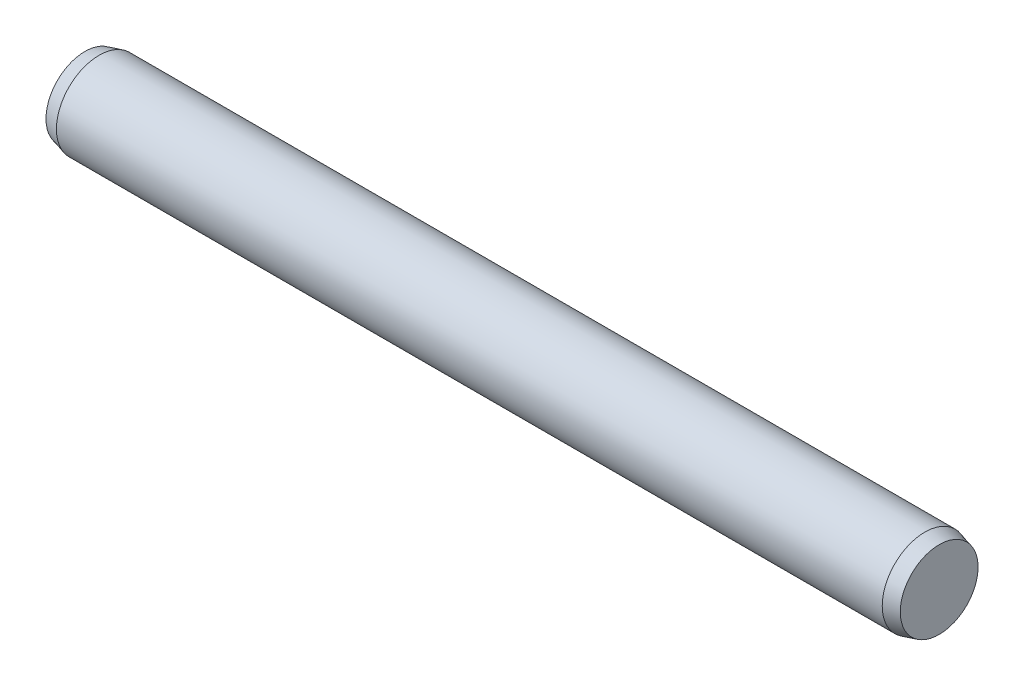
ISO-10303-21;
HEADER;
FILE_DESCRIPTION(('STEP AP214'),'2;1');
FILE_NAME('part.step','',(''),(''),'','','');
FILE_SCHEMA(('AUTOMOTIVE_DESIGN { 1 0 10303 214 1 1 1 1 }'));
ENDSEC;
DATA;
#1=APPLICATION_CONTEXT('core data for automotive mechanical design processes');
#2=APPLICATION_PROTOCOL_DEFINITION('international standard','automotive_design',2000,#1);
#3=PRODUCT_CONTEXT('',#1,'mechanical');
#4=PRODUCT('Part','Part','',(#3));
#5=PRODUCT_RELATED_PRODUCT_CATEGORY('part','',(#4));
#6=PRODUCT_DEFINITION_FORMATION('','',#4);
#7=PRODUCT_DEFINITION_CONTEXT('part definition',#1,'design');
#8=PRODUCT_DEFINITION('design','',#6,#7);
#9=PRODUCT_DEFINITION_SHAPE('','',#8);
#10=(LENGTH_UNIT() NAMED_UNIT(*) SI_UNIT(.MILLI.,.METRE.));
#11=(NAMED_UNIT(*) PLANE_ANGLE_UNIT() SI_UNIT($,.RADIAN.));
#12=(NAMED_UNIT(*) SI_UNIT($,.STERADIAN.) SOLID_ANGLE_UNIT());
#13=UNCERTAINTY_MEASURE_WITH_UNIT(LENGTH_MEASURE(1.E-05),#10,'distance_accuracy_value','');
#14=(GEOMETRIC_REPRESENTATION_CONTEXT(3) GLOBAL_UNCERTAINTY_ASSIGNED_CONTEXT((#13)) GLOBAL_UNIT_ASSIGNED_CONTEXT((#10,
#11,#12)) REPRESENTATION_CONTEXT('',''));
#15=CARTESIAN_POINT('',(0.,0.,0.));
#16=DIRECTION('',(0.,0.,1.));
#17=DIRECTION('',(1.,0.,0.));
#18=AXIS2_PLACEMENT_3D('',#15,#16,#17);
#19=CARTESIAN_POINT('',(0.,1.36602540378444,0.));
#20=DIRECTION('',(1.,0.,0.));
#21=DIRECTION('',(0.,0.,-1.));
#22=AXIS2_PLACEMENT_3D('',#19,#20,#21);
#23=PLANE('',#22);
#24=CARTESIAN_POINT('',(0.,0.,0.));
#25=DIRECTION('',(-1.,0.,0.));
#26=DIRECTION('',(0.,0.,1.));
#27=AXIS2_PLACEMENT_3D('',#24,#25,#26);
#28=CIRCLE('',#27,1.36602540378444);
#29=CARTESIAN_POINT('',(0.,0.,1.36602540378444));
#30=VERTEX_POINT('',#29);
#31=EDGE_CURVE('E55',#30,#30,#28,.T.);
#32=ORIENTED_EDGE('',*,*,#31,.T.);
#33=EDGE_LOOP('',(#32));
#34=FACE_BOUND('',#33,.T.);
#35=ADVANCED_FACE('F41',(#34),#23,.F.);
#36=CARTESIAN_POINT('',(30.,0.,0.));
#37=DIRECTION('',(-1.,0.,0.));
#38=DIRECTION('',(0.,0.,1.));
#39=AXIS2_PLACEMENT_3D('',#36,#37,#38);
#40=PLANE('',#39);
#41=CARTESIAN_POINT('',(30.,0.,0.));
#42=DIRECTION('',(-1.,0.,0.));
#43=DIRECTION('',(0.,0.,1.));
#44=AXIS2_PLACEMENT_3D('',#41,#42,#43);
#45=CIRCLE('',#44,1.36602540378445);
#46=CARTESIAN_POINT('',(30.,0.,1.36602540378445));
#47=VERTEX_POINT('',#46);
#48=EDGE_CURVE('E10',#47,#47,#45,.T.);
#49=ORIENTED_EDGE('',*,*,#48,.F.);
#50=EDGE_LOOP('',(#49));
#51=FACE_BOUND('',#50,.T.);
#52=ADVANCED_FACE('F75',(#51),#40,.F.);
#53=CARTESIAN_POINT('',(30.,0.,0.));
#54=DIRECTION('',(-1.,0.,0.));
#55=DIRECTION('',(0.,0.,1.));
#56=AXIS2_PLACEMENT_3D('',#53,#54,#55);
#57=CONICAL_SURFACE('',#56,1.36602540378445,0.26179938779915);
#58=CARTESIAN_POINT('',(29.5,0.,0.));
#59=DIRECTION('',(-1.,0.,0.));
#60=DIRECTION('',(0.,0.,1.));
#61=AXIS2_PLACEMENT_3D('',#58,#59,#60);
#62=CIRCLE('',#61,1.50000000000001);
#63=CARTESIAN_POINT('',(29.5,0.,1.50000000000001));
#64=VERTEX_POINT('',#63);
#65=EDGE_CURVE('E47',#64,#64,#62,.T.);
#66=ORIENTED_EDGE('',*,*,#65,.F.);
#67=EDGE_LOOP('',(#66));
#68=FACE_BOUND('',#67,.T.);
#69=ORIENTED_EDGE('',*,*,#48,.T.);
#70=EDGE_LOOP('',(#69));
#71=FACE_BOUND('',#70,.T.);
#72=ADVANCED_FACE('F70',(#68,#71),#57,.T.);
#73=CARTESIAN_POINT('',(-6.35,0.,0.));
#74=DIRECTION('',(-1.,0.,0.));
#75=DIRECTION('',(0.,0.,1.));
#76=AXIS2_PLACEMENT_3D('',#73,#74,#75);
#77=CYLINDRICAL_SURFACE('',#76,1.5);
#78=CARTESIAN_POINT('',(0.5,0.,0.));
#79=DIRECTION('',(-1.,0.,0.));
#80=DIRECTION('',(0.,0.,1.));
#81=AXIS2_PLACEMENT_3D('',#78,#79,#80);
#82=CIRCLE('',#81,1.5);
#83=CARTESIAN_POINT('',(0.5,0.,1.5));
#84=VERTEX_POINT('',#83);
#85=EDGE_CURVE('E51',#84,#84,#82,.T.);
#86=ORIENTED_EDGE('',*,*,#85,.F.);
#87=EDGE_LOOP('',(#86));
#88=FACE_BOUND('',#87,.T.);
#89=ORIENTED_EDGE('',*,*,#65,.T.);
#90=EDGE_LOOP('',(#89));
#91=FACE_BOUND('',#90,.T.);
#92=ADVANCED_FACE('F65',(#88,#91),#77,.T.);
#93=CARTESIAN_POINT('',(0.5,0.,0.));
#94=DIRECTION('',(1.,0.,0.));
#95=DIRECTION('',(0.,0.,-1.));
#96=AXIS2_PLACEMENT_3D('',#93,#94,#95);
#97=CONICAL_SURFACE('',#96,1.5,0.261799387799144);
#98=ORIENTED_EDGE('',*,*,#31,.F.);
#99=EDGE_LOOP('',(#98));
#100=FACE_BOUND('',#99,.T.);
#101=ORIENTED_EDGE('',*,*,#85,.T.);
#102=EDGE_LOOP('',(#101));
#103=FACE_BOUND('',#102,.T.);
#104=ADVANCED_FACE('F62',(#100,#103),#97,.T.);
#105=CLOSED_SHELL('',(#35,#52,#72,#92,#104));
#106=MANIFOLD_SOLID_BREP('B2',#105);
#107=ADVANCED_BREP_SHAPE_REPRESENTATION('',(#18,#106),#14);
#108=SHAPE_DEFINITION_REPRESENTATION(#9,#107);
ENDSEC;
END-ISO-10303-21;
